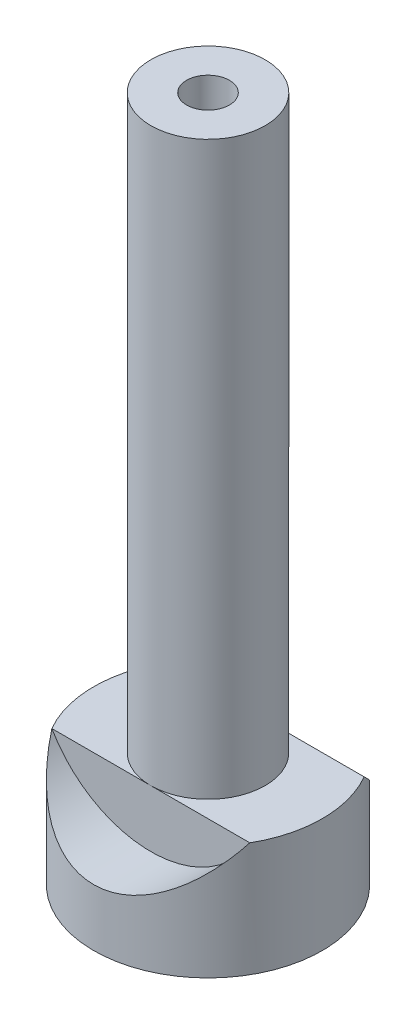
ISO-10303-21;
HEADER;
FILE_DESCRIPTION(('STEP AP214'),'2;1');
FILE_NAME('part.step','',(''),(''),'','','');
FILE_SCHEMA(('AUTOMOTIVE_DESIGN { 1 0 10303 214 1 1 1 1 }'));
ENDSEC;
DATA;
#1=APPLICATION_CONTEXT('core data for automotive mechanical design processes');
#2=APPLICATION_PROTOCOL_DEFINITION('international standard','automotive_design',2000,#1);
#3=PRODUCT_CONTEXT('',#1,'mechanical');
#4=PRODUCT('Part','Part','',(#3));
#5=PRODUCT_RELATED_PRODUCT_CATEGORY('part','',(#4));
#6=PRODUCT_DEFINITION_FORMATION('','',#4);
#7=PRODUCT_DEFINITION_CONTEXT('part definition',#1,'design');
#8=PRODUCT_DEFINITION('design','',#6,#7);
#9=PRODUCT_DEFINITION_SHAPE('','',#8);
#10=(LENGTH_UNIT() NAMED_UNIT(*) SI_UNIT(.MILLI.,.METRE.));
#11=(NAMED_UNIT(*) PLANE_ANGLE_UNIT() SI_UNIT($,.RADIAN.));
#12=(NAMED_UNIT(*) SI_UNIT($,.STERADIAN.) SOLID_ANGLE_UNIT());
#13=UNCERTAINTY_MEASURE_WITH_UNIT(LENGTH_MEASURE(1.E-05),#10,'distance_accuracy_value','');
#14=(GEOMETRIC_REPRESENTATION_CONTEXT(3) GLOBAL_UNCERTAINTY_ASSIGNED_CONTEXT((#13)) GLOBAL_UNIT_ASSIGNED_CONTEXT((#10,
#11,#12)) REPRESENTATION_CONTEXT('',''));
#15=CARTESIAN_POINT('',(0.,0.,0.));
#16=DIRECTION('',(0.,0.,1.));
#17=DIRECTION('',(1.,0.,0.));
#18=AXIS2_PLACEMENT_3D('',#15,#16,#17);
#19=CARTESIAN_POINT('',(0.,-12.7,0.));
#20=DIRECTION('',(0.,1.,0.));
#21=DIRECTION('',(0.,0.,1.));
#22=AXIS2_PLACEMENT_3D('',#19,#20,#21);
#23=CYLINDRICAL_SURFACE('',#22,12.7);
#24=CARTESIAN_POINT('',(0.,-12.7,0.));
#25=DIRECTION('',(0.,-1.,0.));
#26=DIRECTION('',(0.,0.,-1.));
#27=AXIS2_PLACEMENT_3D('',#24,#25,#26);
#28=CIRCLE('',#27,12.7);
#29=CARTESIAN_POINT('',(0.,-12.7,-12.7));
#30=VERTEX_POINT('',#29);
#31=EDGE_CURVE('E90',#30,#30,#28,.T.);
#32=ORIENTED_EDGE('',*,*,#31,.F.);
#33=EDGE_LOOP('',(#32));
#34=FACE_BOUND('',#33,.T.);
#35=CARTESIAN_POINT('',(0.,6.35,0.));
#36=DIRECTION('',(0.,0.707106781186547,-0.707106781186547));
#37=DIRECTION('',(0.,0.707106781186547,0.707106781186547));
#38=AXIS2_PLACEMENT_3D('',#35,#36,#37);
#39=ELLIPSE('',#38,17.9605122421383,12.7);
#40=CARTESIAN_POINT('',(10.9985226280623,0.,-6.35000000000008));
#41=VERTEX_POINT('',#40);
#42=CARTESIAN_POINT('',(-10.9985226280624,0.,-6.34999999999992));
#43=VERTEX_POINT('',#42);
#44=EDGE_CURVE('E75',#41,#43,#39,.T.);
#45=ORIENTED_EDGE('',*,*,#44,.F.);
#46=CARTESIAN_POINT('',(0.,0.,0.));
#47=DIRECTION('',(0.,-1.,0.));
#48=DIRECTION('',(0.,0.,-1.));
#49=AXIS2_PLACEMENT_3D('',#46,#47,#48);
#50=CIRCLE('',#49,12.7);
#51=CARTESIAN_POINT('',(10.9985226280624,0.,6.35));
#52=VERTEX_POINT('',#51);
#53=EDGE_CURVE('E81',#41,#52,#50,.T.);
#54=ORIENTED_EDGE('',*,*,#53,.T.);
#55=CARTESIAN_POINT('',(0.,6.35,0.));
#56=DIRECTION('',(0.,0.707106781186547,0.707106781186547));
#57=DIRECTION('',(0.,0.707106781186547,-0.707106781186547));
#58=AXIS2_PLACEMENT_3D('',#55,#56,#57);
#59=ELLIPSE('',#58,17.9605122421383,12.7);
#60=CARTESIAN_POINT('',(-10.9985226280624,0.,6.35));
#61=VERTEX_POINT('',#60);
#62=EDGE_CURVE('E88',#61,#52,#59,.T.);
#63=ORIENTED_EDGE('',*,*,#62,.F.);
#64=EDGE_CURVE('E84',#61,#43,#50,.T.);
#65=ORIENTED_EDGE('',*,*,#64,.T.);
#66=EDGE_LOOP('',(#45,#54,#63,#65));
#67=FACE_BOUND('',#66,.T.);
#68=ADVANCED_FACE('F33',(#34,#67),#23,.T.);
#69=CARTESIAN_POINT('',(0.,0.,0.));
#70=DIRECTION('',(0.,-1.,0.));
#71=DIRECTION('',(0.,0.,-1.));
#72=AXIS2_PLACEMENT_3D('',#69,#70,#71);
#73=PLANE('',#72);
#74=DIRECTION('',(1.,0.,0.));
#75=VECTOR('',#74,1.);
#76=CARTESIAN_POINT('',(0.,0.,-6.35));
#77=LINE('',#76,#75);
#78=CARTESIAN_POINT('',(0.,0.,-6.34999999999999));
#79=VERTEX_POINT('',#78);
#80=EDGE_CURVE('E48',#43,#79,#77,.T.);
#81=ORIENTED_EDGE('',*,*,#80,.F.);
#82=ORIENTED_EDGE('',*,*,#64,.F.);
#83=DIRECTION('',(-1.,0.,0.));
#84=VECTOR('',#83,1.);
#85=CARTESIAN_POINT('',(0.,0.,6.35));
#86=LINE('',#85,#84);
#87=CARTESIAN_POINT('',(0.,0.,6.35));
#88=VERTEX_POINT('',#87);
#89=EDGE_CURVE('E37',#88,#61,#86,.T.);
#90=ORIENTED_EDGE('',*,*,#89,.F.);
#91=CARTESIAN_POINT('',(0.,0.,0.));
#92=DIRECTION('',(0.,-1.,0.));
#93=DIRECTION('',(0.,0.,-1.));
#94=AXIS2_PLACEMENT_3D('',#91,#92,#93);
#95=CIRCLE('',#94,6.34999999999999);
#96=EDGE_CURVE('E94',#88,#79,#95,.T.);
#97=ORIENTED_EDGE('',*,*,#96,.T.);
#98=EDGE_LOOP('',(#81,#82,#90,#97));
#99=FACE_BOUND('',#98,.T.);
#100=ADVANCED_FACE('F110',(#99),#73,.F.);
#101=EDGE_CURVE('E66',#79,#41,#77,.T.);
#102=ORIENTED_EDGE('',*,*,#101,.F.);
#103=EDGE_CURVE('E55',#79,#88,#95,.T.);
#104=ORIENTED_EDGE('',*,*,#103,.T.);
#105=EDGE_CURVE('E11',#52,#88,#86,.T.);
#106=ORIENTED_EDGE('',*,*,#105,.F.);
#107=ORIENTED_EDGE('',*,*,#53,.F.);
#108=EDGE_LOOP('',(#102,#104,#106,#107));
#109=FACE_BOUND('',#108,.T.);
#110=ADVANCED_FACE('F87',(#109),#73,.F.);
#111=CARTESIAN_POINT('',(0.,63.5,0.));
#112=DIRECTION('',(0.,-1.,0.));
#113=DIRECTION('',(0.,0.,-1.));
#114=AXIS2_PLACEMENT_3D('',#111,#112,#113);
#115=CYLINDRICAL_SURFACE('',#114,6.34999999999999);
#116=ORIENTED_EDGE('',*,*,#103,.F.);
#117=ORIENTED_EDGE('',*,*,#96,.F.);
#118=EDGE_LOOP('',(#116,#117));
#119=FACE_BOUND('',#118,.T.);
#120=CARTESIAN_POINT('',(0.,63.5,0.));
#121=DIRECTION('',(0.,1.,0.));
#122=DIRECTION('',(0.,0.,1.));
#123=AXIS2_PLACEMENT_3D('',#120,#121,#122);
#124=CIRCLE('',#123,6.34999999999999);
#125=CARTESIAN_POINT('',(0.,63.5,6.34999999999999));
#126=VERTEX_POINT('',#125);
#127=EDGE_CURVE('E96',#126,#126,#124,.T.);
#128=ORIENTED_EDGE('',*,*,#127,.F.);
#129=EDGE_LOOP('',(#128));
#130=FACE_BOUND('',#129,.T.);
#131=ADVANCED_FACE('F35',(#119,#130),#115,.T.);
#132=CARTESIAN_POINT('',(0.,63.5,0.));
#133=DIRECTION('',(0.,1.,0.));
#134=DIRECTION('',(0.,0.,1.));
#135=AXIS2_PLACEMENT_3D('',#132,#133,#134);
#136=PLANE('',#135);
#137=CARTESIAN_POINT('',(0.,63.5,0.));
#138=DIRECTION('',(0.,1.,0.));
#139=DIRECTION('',(0.,0.,1.));
#140=AXIS2_PLACEMENT_3D('',#137,#138,#139);
#141=CIRCLE('',#140,2.38125);
#142=CARTESIAN_POINT('',(0.,63.5,2.38125));
#143=VERTEX_POINT('',#142);
#144=EDGE_CURVE('E112',#143,#143,#141,.T.);
#145=ORIENTED_EDGE('',*,*,#144,.F.);
#146=EDGE_LOOP('',(#145));
#147=FACE_BOUND('',#146,.T.);
#148=ORIENTED_EDGE('',*,*,#127,.T.);
#149=EDGE_LOOP('',(#148));
#150=FACE_BOUND('',#149,.T.);
#151=ADVANCED_FACE('F126',(#147,#150),#136,.T.);
#152=CARTESIAN_POINT('',(0.,-12.7,0.));
#153=DIRECTION('',(0.,-1.,0.));
#154=DIRECTION('',(0.,0.,-1.));
#155=AXIS2_PLACEMENT_3D('',#152,#153,#154);
#156=PLANE('',#155);
#157=ORIENTED_EDGE('',*,*,#31,.T.);
#158=EDGE_LOOP('',(#157));
#159=FACE_BOUND('',#158,.T.);
#160=ADVANCED_FACE('F128',(#159),#156,.T.);
#161=CARTESIAN_POINT('',(0.,6.35,12.7));
#162=DIRECTION('',(0.,0.,-1.));
#163=DIRECTION('',(-1.,0.,0.));
#164=AXIS2_PLACEMENT_3D('',#161,#162,#163);
#165=CYLINDRICAL_SURFACE('',#164,12.7);
#166=ORIENTED_EDGE('',*,*,#62,.T.);
#167=CARTESIAN_POINT('',(0.,6.35,6.35));
#168=DIRECTION('',(0.,0.,1.));
#169=DIRECTION('',(1.,0.,0.));
#170=AXIS2_PLACEMENT_3D('',#167,#168,#169);
#171=CIRCLE('',#170,12.7);
#172=EDGE_CURVE('E85',#61,#52,#171,.T.);
#173=ORIENTED_EDGE('',*,*,#172,.F.);
#174=EDGE_LOOP('',(#166,#173));
#175=FACE_BOUND('',#174,.T.);
#176=ADVANCED_FACE('F108',(#175),#165,.F.);
#177=CARTESIAN_POINT('',(0.,6.35,6.35));
#178=DIRECTION('',(0.,0.,1.));
#179=DIRECTION('',(1.,0.,0.));
#180=AXIS2_PLACEMENT_3D('',#177,#178,#179);
#181=PLANE('',#180);
#182=ORIENTED_EDGE('',*,*,#105,.T.);
#183=ORIENTED_EDGE('',*,*,#89,.T.);
#184=ORIENTED_EDGE('',*,*,#172,.T.);
#185=EDGE_LOOP('',(#182,#183,#184));
#186=FACE_BOUND('',#185,.T.);
#187=ADVANCED_FACE('F104',(#186),#181,.T.);
#188=CARTESIAN_POINT('',(0.,6.35,-12.7000000000001));
#189=DIRECTION('',(0.,0.,1.));
#190=DIRECTION('',(1.,0.,0.));
#191=AXIS2_PLACEMENT_3D('',#188,#189,#190);
#192=CYLINDRICAL_SURFACE('',#191,12.7);
#193=ORIENTED_EDGE('',*,*,#44,.T.);
#194=CARTESIAN_POINT('',(0.,6.35,-6.35));
#195=DIRECTION('',(0.,0.,-1.));
#196=DIRECTION('',(-1.,0.,0.));
#197=AXIS2_PLACEMENT_3D('',#194,#195,#196);
#198=CIRCLE('',#197,12.7);
#199=EDGE_CURVE('E69',#41,#43,#198,.T.);
#200=ORIENTED_EDGE('',*,*,#199,.F.);
#201=EDGE_LOOP('',(#193,#200));
#202=FACE_BOUND('',#201,.T.);
#203=ADVANCED_FACE('F74',(#202),#192,.F.);
#204=CARTESIAN_POINT('',(0.,6.35,-6.35));
#205=DIRECTION('',(0.,0.,-1.));
#206=DIRECTION('',(-1.,0.,0.));
#207=AXIS2_PLACEMENT_3D('',#204,#205,#206);
#208=PLANE('',#207);
#209=ORIENTED_EDGE('',*,*,#80,.T.);
#210=ORIENTED_EDGE('',*,*,#101,.T.);
#211=ORIENTED_EDGE('',*,*,#199,.T.);
#212=EDGE_LOOP('',(#209,#210,#211));
#213=FACE_BOUND('',#212,.T.);
#214=ADVANCED_FACE('F68',(#213),#208,.T.);
#215=CARTESIAN_POINT('',(0.,12.7,0.));
#216=DIRECTION('',(0.,1.,0.));
#217=DIRECTION('',(0.,0.,1.));
#218=AXIS2_PLACEMENT_3D('',#215,#216,#217);
#219=CYLINDRICAL_SURFACE('',#218,2.38125);
#220=CARTESIAN_POINT('',(0.,12.7,0.));
#221=DIRECTION('',(0.,1.,0.));
#222=DIRECTION('',(0.,0.,1.));
#223=AXIS2_PLACEMENT_3D('',#220,#221,#222);
#224=CIRCLE('',#223,2.38125);
#225=CARTESIAN_POINT('',(0.,12.7,2.38125));
#226=VERTEX_POINT('',#225);
#227=EDGE_CURVE('E76',#226,#226,#224,.T.);
#228=ORIENTED_EDGE('',*,*,#227,.F.);
#229=EDGE_LOOP('',(#228));
#230=FACE_BOUND('',#229,.T.);
#231=ORIENTED_EDGE('',*,*,#144,.T.);
#232=EDGE_LOOP('',(#231));
#233=FACE_BOUND('',#232,.T.);
#234=ADVANCED_FACE('F120',(#230,#233),#219,.F.);
#235=CARTESIAN_POINT('',(0.,12.7,0.));
#236=DIRECTION('',(0.,1.,0.));
#237=DIRECTION('',(0.,0.,1.));
#238=AXIS2_PLACEMENT_3D('',#235,#236,#237);
#239=PLANE('',#238);
#240=ORIENTED_EDGE('',*,*,#227,.T.);
#241=EDGE_LOOP('',(#240));
#242=FACE_BOUND('',#241,.T.);
#243=ADVANCED_FACE('F118',(#242),#239,.T.);
#244=CLOSED_SHELL('',(#68,#100,#110,#131,#151,#160,#176,#187,#203,#214,#234,#243));
#245=MANIFOLD_SOLID_BREP('B2',#244);
#246=ADVANCED_BREP_SHAPE_REPRESENTATION('',(#18,#245),#14);
#247=SHAPE_DEFINITION_REPRESENTATION(#9,#246);
ENDSEC;
END-ISO-10303-21;
